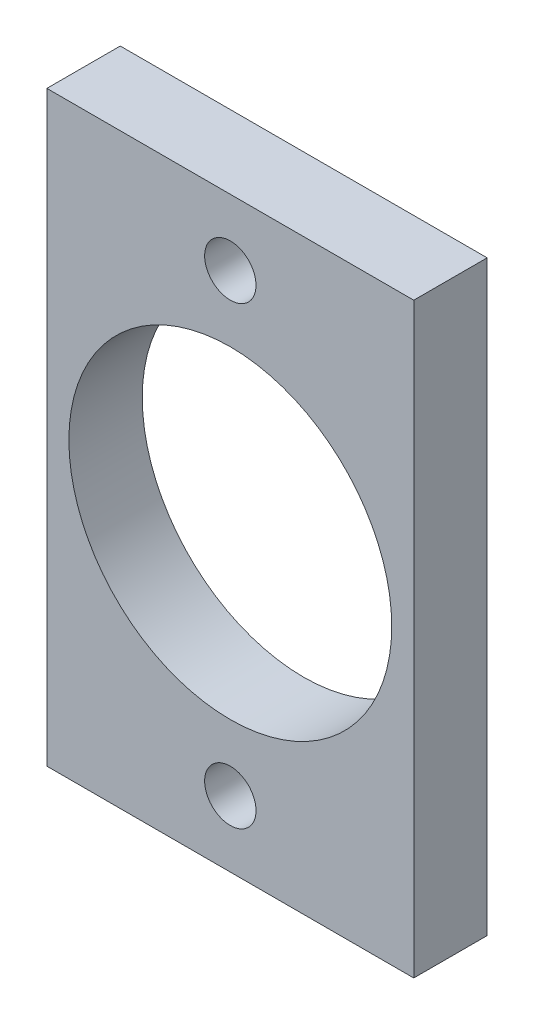
ISO-10303-21;
HEADER;
FILE_DESCRIPTION(('STEP AP214'),'2;1');
FILE_NAME('part.step','',(''),(''),'','','');
FILE_SCHEMA(('AUTOMOTIVE_DESIGN { 1 0 10303 214 1 1 1 1 }'));
ENDSEC;
DATA;
#1=APPLICATION_CONTEXT('core data for automotive mechanical design processes');
#2=APPLICATION_PROTOCOL_DEFINITION('international standard','automotive_design',2000,#1);
#3=PRODUCT_CONTEXT('',#1,'mechanical');
#4=PRODUCT('Part','Part','',(#3));
#5=PRODUCT_RELATED_PRODUCT_CATEGORY('part','',(#4));
#6=PRODUCT_DEFINITION_FORMATION('','',#4);
#7=PRODUCT_DEFINITION_CONTEXT('part definition',#1,'design');
#8=PRODUCT_DEFINITION('design','',#6,#7);
#9=PRODUCT_DEFINITION_SHAPE('','',#8);
#10=(LENGTH_UNIT() NAMED_UNIT(*) SI_UNIT(.MILLI.,.METRE.));
#11=(NAMED_UNIT(*) PLANE_ANGLE_UNIT() SI_UNIT($,.RADIAN.));
#12=(NAMED_UNIT(*) SI_UNIT($,.STERADIAN.) SOLID_ANGLE_UNIT());
#13=UNCERTAINTY_MEASURE_WITH_UNIT(LENGTH_MEASURE(1.E-05),#10,'distance_accuracy_value','');
#14=(GEOMETRIC_REPRESENTATION_CONTEXT(3) GLOBAL_UNCERTAINTY_ASSIGNED_CONTEXT((#13)) GLOBAL_UNIT_ASSIGNED_CONTEXT((#10,
#11,#12)) REPRESENTATION_CONTEXT('',''));
#15=CARTESIAN_POINT('',(0.,0.,0.));
#16=DIRECTION('',(0.,0.,1.));
#17=DIRECTION('',(1.,0.,0.));
#18=AXIS2_PLACEMENT_3D('',#15,#16,#17);
#19=CARTESIAN_POINT('',(0.,0.,5.));
#20=DIRECTION('',(0.,0.,1.));
#21=DIRECTION('',(1.,0.,0.));
#22=AXIS2_PLACEMENT_3D('',#19,#20,#21);
#23=PLANE('',#22);
#24=CARTESIAN_POINT('',(31.9155912475696,299.5,5.));
#25=DIRECTION('',(0.,0.,1.));
#26=DIRECTION('',(1.,0.,0.));
#27=AXIS2_PLACEMENT_3D('',#24,#25,#26);
#28=CIRCLE('',#27,1.75);
#29=CARTESIAN_POINT('',(33.6655912475696,299.5,5.));
#30=VERTEX_POINT('',#29);
#31=EDGE_CURVE('E113',#30,#30,#28,.T.);
#32=ORIENTED_EDGE('',*,*,#31,.F.);
#33=EDGE_LOOP('',(#32));
#34=FACE_BOUND('',#33,.T.);
#35=DIRECTION('',(0.,-1.,0.));
#36=VECTOR('',#35,1.);
#37=CARTESIAN_POINT('',(19.4155912475696,335.,5.));
#38=LINE('',#37,#36);
#39=CARTESIAN_POINT('',(19.4155912475696,335.,5.));
#40=VERTEX_POINT('',#39);
#41=CARTESIAN_POINT('',(19.4155912475696,295.,5.));
#42=VERTEX_POINT('',#41);
#43=EDGE_CURVE('E83',#40,#42,#38,.T.);
#44=ORIENTED_EDGE('',*,*,#43,.T.);
#45=DIRECTION('',(1.,0.,0.));
#46=VECTOR('',#45,1.);
#47=CARTESIAN_POINT('',(19.4155912475696,295.,5.));
#48=LINE('',#47,#46);
#49=CARTESIAN_POINT('',(44.4155912475696,295.,5.));
#50=VERTEX_POINT('',#49);
#51=EDGE_CURVE('E78',#42,#50,#48,.T.);
#52=ORIENTED_EDGE('',*,*,#51,.T.);
#53=DIRECTION('',(0.,1.,0.));
#54=VECTOR('',#53,1.);
#55=CARTESIAN_POINT('',(44.4155912475696,335.,5.));
#56=LINE('',#55,#54);
#57=CARTESIAN_POINT('',(44.4155912475696,335.,5.));
#58=VERTEX_POINT('',#57);
#59=EDGE_CURVE('E81',#50,#58,#56,.T.);
#60=ORIENTED_EDGE('',*,*,#59,.T.);
#61=DIRECTION('',(-1.,0.,0.));
#62=VECTOR('',#61,1.);
#63=CARTESIAN_POINT('',(19.4155912475696,335.,5.));
#64=LINE('',#63,#62);
#65=EDGE_CURVE('E48',#58,#40,#64,.T.);
#66=ORIENTED_EDGE('',*,*,#65,.T.);
#67=EDGE_LOOP('',(#44,#52,#60,#66));
#68=FACE_BOUND('',#67,.T.);
#69=CARTESIAN_POINT('',(31.9155912475696,315.,5.));
#70=DIRECTION('',(0.,0.,1.));
#71=DIRECTION('',(1.,0.,0.));
#72=AXIS2_PLACEMENT_3D('',#69,#70,#71);
#73=CIRCLE('',#72,11.);
#74=CARTESIAN_POINT('',(42.9155912475696,315.,5.));
#75=VERTEX_POINT('',#74);
#76=EDGE_CURVE('E98',#75,#75,#73,.T.);
#77=ORIENTED_EDGE('',*,*,#76,.F.);
#78=EDGE_LOOP('',(#77));
#79=FACE_BOUND('',#78,.T.);
#80=CARTESIAN_POINT('',(31.9155912475696,330.5,5.));
#81=DIRECTION('',(0.,0.,1.));
#82=DIRECTION('',(1.,0.,0.));
#83=AXIS2_PLACEMENT_3D('',#80,#81,#82);
#84=CIRCLE('',#83,1.75);
#85=CARTESIAN_POINT('',(33.6655912475696,330.5,5.));
#86=VERTEX_POINT('',#85);
#87=EDGE_CURVE('E119',#86,#86,#84,.T.);
#88=ORIENTED_EDGE('',*,*,#87,.F.);
#89=EDGE_LOOP('',(#88));
#90=FACE_BOUND('',#89,.T.);
#91=ADVANCED_FACE('F31',(#34,#68,#79,#90),#23,.T.);
#92=CARTESIAN_POINT('',(0.,0.,0.));
#93=DIRECTION('',(0.,0.,1.));
#94=DIRECTION('',(1.,0.,0.));
#95=AXIS2_PLACEMENT_3D('',#92,#93,#94);
#96=PLANE('',#95);
#97=DIRECTION('',(0.,-1.,0.));
#98=VECTOR('',#97,1.);
#99=CARTESIAN_POINT('',(19.4155912475696,335.,0.));
#100=LINE('',#99,#98);
#101=CARTESIAN_POINT('',(19.4155912475696,335.,0.));
#102=VERTEX_POINT('',#101);
#103=CARTESIAN_POINT('',(19.4155912475696,295.,0.));
#104=VERTEX_POINT('',#103);
#105=EDGE_CURVE('E95',#102,#104,#100,.T.);
#106=ORIENTED_EDGE('',*,*,#105,.F.);
#107=DIRECTION('',(-1.,0.,0.));
#108=VECTOR('',#107,1.);
#109=CARTESIAN_POINT('',(19.4155912475696,335.,0.));
#110=LINE('',#109,#108);
#111=CARTESIAN_POINT('',(44.4155912475696,335.,0.));
#112=VERTEX_POINT('',#111);
#113=EDGE_CURVE('E71',#112,#102,#110,.T.);
#114=ORIENTED_EDGE('',*,*,#113,.F.);
#115=DIRECTION('',(0.,1.,0.));
#116=VECTOR('',#115,1.);
#117=CARTESIAN_POINT('',(44.4155912475696,335.,0.));
#118=LINE('',#117,#116);
#119=CARTESIAN_POINT('',(44.4155912475696,295.,0.));
#120=VERTEX_POINT('',#119);
#121=EDGE_CURVE('E65',#120,#112,#118,.T.);
#122=ORIENTED_EDGE('',*,*,#121,.F.);
#123=DIRECTION('',(1.,0.,0.));
#124=VECTOR('',#123,1.);
#125=CARTESIAN_POINT('',(19.4155912475696,295.,0.));
#126=LINE('',#125,#124);
#127=EDGE_CURVE('E87',#104,#120,#126,.T.);
#128=ORIENTED_EDGE('',*,*,#127,.F.);
#129=EDGE_LOOP('',(#106,#114,#122,#128));
#130=FACE_BOUND('',#129,.T.);
#131=CARTESIAN_POINT('',(31.9155912475696,315.,0.));
#132=DIRECTION('',(0.,0.,1.));
#133=DIRECTION('',(1.,0.,0.));
#134=AXIS2_PLACEMENT_3D('',#131,#132,#133);
#135=CIRCLE('',#134,11.);
#136=CARTESIAN_POINT('',(42.9155912475696,315.,0.));
#137=VERTEX_POINT('',#136);
#138=EDGE_CURVE('E110',#137,#137,#135,.T.);
#139=ORIENTED_EDGE('',*,*,#138,.T.);
#140=EDGE_LOOP('',(#139));
#141=FACE_BOUND('',#140,.T.);
#142=CARTESIAN_POINT('',(31.9155912475696,299.5,0.));
#143=DIRECTION('',(0.,0.,1.));
#144=DIRECTION('',(1.,0.,0.));
#145=AXIS2_PLACEMENT_3D('',#142,#143,#144);
#146=CIRCLE('',#145,1.75);
#147=CARTESIAN_POINT('',(33.6655912475696,299.5,0.));
#148=VERTEX_POINT('',#147);
#149=EDGE_CURVE('E116',#148,#148,#146,.T.);
#150=ORIENTED_EDGE('',*,*,#149,.T.);
#151=EDGE_LOOP('',(#150));
#152=FACE_BOUND('',#151,.T.);
#153=CARTESIAN_POINT('',(31.9155912475696,330.5,0.));
#154=DIRECTION('',(0.,0.,1.));
#155=DIRECTION('',(1.,0.,0.));
#156=AXIS2_PLACEMENT_3D('',#153,#154,#155);
#157=CIRCLE('',#156,1.75);
#158=CARTESIAN_POINT('',(33.6655912475696,330.5,0.));
#159=VERTEX_POINT('',#158);
#160=EDGE_CURVE('E122',#159,#159,#157,.T.);
#161=ORIENTED_EDGE('',*,*,#160,.T.);
#162=EDGE_LOOP('',(#161));
#163=FACE_BOUND('',#162,.T.);
#164=ADVANCED_FACE('F106',(#130,#141,#152,#163),#96,.F.);
#165=CARTESIAN_POINT('',(19.4155912475696,335.,5.));
#166=DIRECTION('',(1.,0.,0.));
#167=DIRECTION('',(0.,1.,0.));
#168=AXIS2_PLACEMENT_3D('',#165,#166,#167);
#169=PLANE('',#168);
#170=ORIENTED_EDGE('',*,*,#105,.T.);
#171=DIRECTION('',(0.,0.,-1.));
#172=VECTOR('',#171,1.);
#173=CARTESIAN_POINT('',(19.4155912475696,295.,5.));
#174=LINE('',#173,#172);
#175=EDGE_CURVE('E11',#42,#104,#174,.T.);
#176=ORIENTED_EDGE('',*,*,#175,.F.);
#177=ORIENTED_EDGE('',*,*,#43,.F.);
#178=DIRECTION('',(0.,0.,-1.));
#179=VECTOR('',#178,1.);
#180=CARTESIAN_POINT('',(19.4155912475696,335.,5.));
#181=LINE('',#180,#179);
#182=EDGE_CURVE('E91',#40,#102,#181,.T.);
#183=ORIENTED_EDGE('',*,*,#182,.T.);
#184=EDGE_LOOP('',(#170,#176,#177,#183));
#185=FACE_BOUND('',#184,.T.);
#186=ADVANCED_FACE('F33',(#185),#169,.F.);
#187=CARTESIAN_POINT('',(19.4155912475696,295.,5.));
#188=DIRECTION('',(0.,1.,0.));
#189=DIRECTION('',(0.,0.,1.));
#190=AXIS2_PLACEMENT_3D('',#187,#188,#189);
#191=PLANE('',#190);
#192=ORIENTED_EDGE('',*,*,#127,.T.);
#193=DIRECTION('',(0.,0.,-1.));
#194=VECTOR('',#193,1.);
#195=CARTESIAN_POINT('',(44.4155912475696,295.,5.));
#196=LINE('',#195,#194);
#197=EDGE_CURVE('E40',#50,#120,#196,.T.);
#198=ORIENTED_EDGE('',*,*,#197,.F.);
#199=ORIENTED_EDGE('',*,*,#51,.F.);
#200=ORIENTED_EDGE('',*,*,#175,.T.);
#201=EDGE_LOOP('',(#192,#198,#199,#200));
#202=FACE_BOUND('',#201,.T.);
#203=ADVANCED_FACE('F86',(#202),#191,.F.);
#204=CARTESIAN_POINT('',(44.4155912475696,335.,5.));
#205=DIRECTION('',(-1.,0.,0.));
#206=DIRECTION('',(0.,0.,1.));
#207=AXIS2_PLACEMENT_3D('',#204,#205,#206);
#208=PLANE('',#207);
#209=ORIENTED_EDGE('',*,*,#121,.T.);
#210=DIRECTION('',(0.,0.,-1.));
#211=VECTOR('',#210,1.);
#212=CARTESIAN_POINT('',(44.4155912475696,335.,5.));
#213=LINE('',#212,#211);
#214=EDGE_CURVE('E88',#58,#112,#213,.T.);
#215=ORIENTED_EDGE('',*,*,#214,.F.);
#216=ORIENTED_EDGE('',*,*,#59,.F.);
#217=ORIENTED_EDGE('',*,*,#197,.T.);
#218=EDGE_LOOP('',(#209,#215,#216,#217));
#219=FACE_BOUND('',#218,.T.);
#220=ADVANCED_FACE('F89',(#219),#208,.F.);
#221=CARTESIAN_POINT('',(19.4155912475696,335.,5.));
#222=DIRECTION('',(0.,-1.,0.));
#223=DIRECTION('',(0.,0.,-1.));
#224=AXIS2_PLACEMENT_3D('',#221,#222,#223);
#225=PLANE('',#224);
#226=ORIENTED_EDGE('',*,*,#113,.T.);
#227=ORIENTED_EDGE('',*,*,#182,.F.);
#228=ORIENTED_EDGE('',*,*,#65,.F.);
#229=ORIENTED_EDGE('',*,*,#214,.T.);
#230=EDGE_LOOP('',(#226,#227,#228,#229));
#231=FACE_BOUND('',#230,.T.);
#232=ADVANCED_FACE('F103',(#231),#225,.F.);
#233=CARTESIAN_POINT('',(31.9155912475696,315.,5.));
#234=DIRECTION('',(0.,0.,-1.));
#235=DIRECTION('',(-1.,0.,0.));
#236=AXIS2_PLACEMENT_3D('',#233,#234,#235);
#237=CYLINDRICAL_SURFACE('',#236,11.);
#238=ORIENTED_EDGE('',*,*,#76,.T.);
#239=EDGE_LOOP('',(#238));
#240=FACE_BOUND('',#239,.T.);
#241=ORIENTED_EDGE('',*,*,#138,.F.);
#242=EDGE_LOOP('',(#241));
#243=FACE_BOUND('',#242,.T.);
#244=ADVANCED_FACE('F140',(#240,#243),#237,.F.);
#245=CARTESIAN_POINT('',(31.9155912475696,299.5,5.));
#246=DIRECTION('',(0.,0.,-1.));
#247=DIRECTION('',(-1.,0.,0.));
#248=AXIS2_PLACEMENT_3D('',#245,#246,#247);
#249=CYLINDRICAL_SURFACE('',#248,1.75);
#250=ORIENTED_EDGE('',*,*,#31,.T.);
#251=EDGE_LOOP('',(#250));
#252=FACE_BOUND('',#251,.T.);
#253=ORIENTED_EDGE('',*,*,#149,.F.);
#254=EDGE_LOOP('',(#253));
#255=FACE_BOUND('',#254,.T.);
#256=ADVANCED_FACE('F186',(#252,#255),#249,.F.);
#257=CARTESIAN_POINT('',(31.9155912475696,330.5,5.));
#258=DIRECTION('',(0.,0.,-1.));
#259=DIRECTION('',(-1.,0.,0.));
#260=AXIS2_PLACEMENT_3D('',#257,#258,#259);
#261=CYLINDRICAL_SURFACE('',#260,1.75);
#262=ORIENTED_EDGE('',*,*,#87,.T.);
#263=EDGE_LOOP('',(#262));
#264=FACE_BOUND('',#263,.T.);
#265=ORIENTED_EDGE('',*,*,#160,.F.);
#266=EDGE_LOOP('',(#265));
#267=FACE_BOUND('',#266,.T.);
#268=ADVANCED_FACE('F128',(#264,#267),#261,.F.);
#269=CLOSED_SHELL('',(#91,#164,#186,#203,#220,#232,#244,#256,#268));
#270=MANIFOLD_SOLID_BREP('B2',#269);
#271=ADVANCED_BREP_SHAPE_REPRESENTATION('',(#18,#270),#14);
#272=SHAPE_DEFINITION_REPRESENTATION(#9,#271);
ENDSEC;
END-ISO-10303-21;
